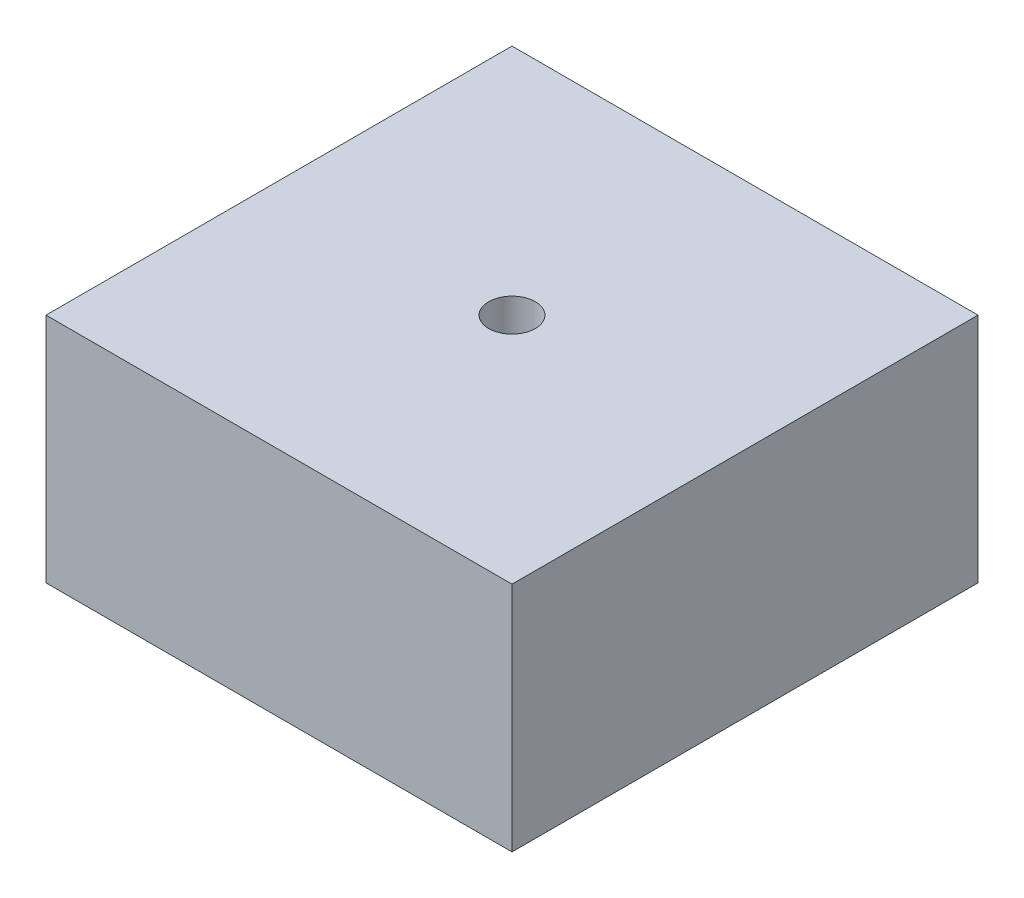
ISO-10303-21;
HEADER;
FILE_DESCRIPTION(('STEP AP214'),'2;1');
FILE_NAME('part.step','',(''),(''),'','','');
FILE_SCHEMA(('AUTOMOTIVE_DESIGN { 1 0 10303 214 1 1 1 1 }'));
ENDSEC;
DATA;
#1=APPLICATION_CONTEXT('core data for automotive mechanical design processes');
#2=APPLICATION_PROTOCOL_DEFINITION('international standard','automotive_design',2000,#1);
#3=PRODUCT_CONTEXT('',#1,'mechanical');
#4=PRODUCT('Part','Part','',(#3));
#5=PRODUCT_RELATED_PRODUCT_CATEGORY('part','',(#4));
#6=PRODUCT_DEFINITION_FORMATION('','',#4);
#7=PRODUCT_DEFINITION_CONTEXT('part definition',#1,'design');
#8=PRODUCT_DEFINITION('design','',#6,#7);
#9=PRODUCT_DEFINITION_SHAPE('','',#8);
#10=(LENGTH_UNIT() NAMED_UNIT(*) SI_UNIT(.MILLI.,.METRE.));
#11=(NAMED_UNIT(*) PLANE_ANGLE_UNIT() SI_UNIT($,.RADIAN.));
#12=(NAMED_UNIT(*) SI_UNIT($,.STERADIAN.) SOLID_ANGLE_UNIT());
#13=UNCERTAINTY_MEASURE_WITH_UNIT(LENGTH_MEASURE(1.E-05),#10,'distance_accuracy_value','');
#14=(GEOMETRIC_REPRESENTATION_CONTEXT(3) GLOBAL_UNCERTAINTY_ASSIGNED_CONTEXT((#13)) GLOBAL_UNIT_ASSIGNED_CONTEXT((#10,
#11,#12)) REPRESENTATION_CONTEXT('',''));
#15=CARTESIAN_POINT('',(0.,0.,0.));
#16=DIRECTION('',(0.,0.,1.));
#17=DIRECTION('',(1.,0.,0.));
#18=AXIS2_PLACEMENT_3D('',#15,#16,#17);
#19=CARTESIAN_POINT('',(50.,37.2625,50.));
#20=DIRECTION('',(-1.,0.,0.));
#21=DIRECTION('',(0.,0.,1.));
#22=AXIS2_PLACEMENT_3D('',#19,#20,#21);
#23=PLANE('',#22);
#24=DIRECTION('',(0.,0.,-1.));
#25=VECTOR('',#24,1.);
#26=CARTESIAN_POINT('',(50.,-12.5,50.));
#27=LINE('',#26,#25);
#28=CARTESIAN_POINT('',(50.,-12.5,50.));
#29=VERTEX_POINT('',#28);
#30=CARTESIAN_POINT('',(50.,-12.5,-50.));
#31=VERTEX_POINT('',#30);
#32=EDGE_CURVE('E94',#29,#31,#27,.T.);
#33=ORIENTED_EDGE('',*,*,#32,.T.);
#34=DIRECTION('',(0.,-1.,0.));
#35=VECTOR('',#34,1.);
#36=CARTESIAN_POINT('',(50.,37.2625,-50.));
#37=LINE('',#36,#35);
#38=CARTESIAN_POINT('',(50.,37.2625,-50.));
#39=VERTEX_POINT('',#38);
#40=EDGE_CURVE('E11',#39,#31,#37,.T.);
#41=ORIENTED_EDGE('',*,*,#40,.F.);
#42=DIRECTION('',(0.,0.,-1.));
#43=VECTOR('',#42,1.);
#44=CARTESIAN_POINT('',(50.,37.2625,50.));
#45=LINE('',#44,#43);
#46=CARTESIAN_POINT('',(50.,37.2625,50.));
#47=VERTEX_POINT('',#46);
#48=EDGE_CURVE('E82',#47,#39,#45,.T.);
#49=ORIENTED_EDGE('',*,*,#48,.F.);
#50=DIRECTION('',(0.,-1.,0.));
#51=VECTOR('',#50,1.);
#52=CARTESIAN_POINT('',(50.,37.2625,50.));
#53=LINE('',#52,#51);
#54=EDGE_CURVE('E90',#47,#29,#53,.T.);
#55=ORIENTED_EDGE('',*,*,#54,.T.);
#56=EDGE_LOOP('',(#33,#41,#49,#55));
#57=FACE_BOUND('',#56,.T.);
#58=ADVANCED_FACE('F31',(#57),#23,.F.);
#59=CARTESIAN_POINT('',(-50.,37.2625,-50.));
#60=DIRECTION('',(0.,0.,1.));
#61=DIRECTION('',(1.,0.,0.));
#62=AXIS2_PLACEMENT_3D('',#59,#60,#61);
#63=PLANE('',#62);
#64=DIRECTION('',(-1.,0.,0.));
#65=VECTOR('',#64,1.);
#66=CARTESIAN_POINT('',(-50.,-12.5,-50.));
#67=LINE('',#66,#65);
#68=CARTESIAN_POINT('',(-50.,-12.5,-50.));
#69=VERTEX_POINT('',#68);
#70=EDGE_CURVE('E86',#31,#69,#67,.T.);
#71=ORIENTED_EDGE('',*,*,#70,.T.);
#72=DIRECTION('',(0.,-1.,0.));
#73=VECTOR('',#72,1.);
#74=CARTESIAN_POINT('',(-50.,37.2625,-50.));
#75=LINE('',#74,#73);
#76=CARTESIAN_POINT('',(-50.,37.2625,-50.));
#77=VERTEX_POINT('',#76);
#78=EDGE_CURVE('E39',#77,#69,#75,.T.);
#79=ORIENTED_EDGE('',*,*,#78,.F.);
#80=DIRECTION('',(-1.,0.,0.));
#81=VECTOR('',#80,1.);
#82=CARTESIAN_POINT('',(-50.,37.2625,-50.));
#83=LINE('',#82,#81);
#84=EDGE_CURVE('E77',#39,#77,#83,.T.);
#85=ORIENTED_EDGE('',*,*,#84,.F.);
#86=ORIENTED_EDGE('',*,*,#40,.T.);
#87=EDGE_LOOP('',(#71,#79,#85,#86));
#88=FACE_BOUND('',#87,.T.);
#89=ADVANCED_FACE('F85',(#88),#63,.F.);
#90=CARTESIAN_POINT('',(-50.,37.2625,50.));
#91=DIRECTION('',(1.,0.,0.));
#92=DIRECTION('',(0.,0.,-1.));
#93=AXIS2_PLACEMENT_3D('',#90,#91,#92);
#94=PLANE('',#93);
#95=DIRECTION('',(0.,0.,1.));
#96=VECTOR('',#95,1.);
#97=CARTESIAN_POINT('',(-50.,-12.5,50.));
#98=LINE('',#97,#96);
#99=CARTESIAN_POINT('',(-50.,-12.5,50.));
#100=VERTEX_POINT('',#99);
#101=EDGE_CURVE('E64',#69,#100,#98,.T.);
#102=ORIENTED_EDGE('',*,*,#101,.T.);
#103=DIRECTION('',(0.,-1.,0.));
#104=VECTOR('',#103,1.);
#105=CARTESIAN_POINT('',(-50.,37.2625,50.));
#106=LINE('',#105,#104);
#107=CARTESIAN_POINT('',(-50.,37.2625,50.));
#108=VERTEX_POINT('',#107);
#109=EDGE_CURVE('E87',#108,#100,#106,.T.);
#110=ORIENTED_EDGE('',*,*,#109,.F.);
#111=DIRECTION('',(0.,0.,1.));
#112=VECTOR('',#111,1.);
#113=CARTESIAN_POINT('',(-50.,37.2625,50.));
#114=LINE('',#113,#112);
#115=EDGE_CURVE('E80',#77,#108,#114,.T.);
#116=ORIENTED_EDGE('',*,*,#115,.F.);
#117=ORIENTED_EDGE('',*,*,#78,.T.);
#118=EDGE_LOOP('',(#102,#110,#116,#117));
#119=FACE_BOUND('',#118,.T.);
#120=ADVANCED_FACE('F88',(#119),#94,.F.);
#121=CARTESIAN_POINT('',(-50.,37.2625,50.));
#122=DIRECTION('',(0.,0.,-1.));
#123=DIRECTION('',(-1.,0.,0.));
#124=AXIS2_PLACEMENT_3D('',#121,#122,#123);
#125=PLANE('',#124);
#126=DIRECTION('',(1.,0.,0.));
#127=VECTOR('',#126,1.);
#128=CARTESIAN_POINT('',(-50.,-12.5,50.));
#129=LINE('',#128,#127);
#130=EDGE_CURVE('E70',#100,#29,#129,.T.);
#131=ORIENTED_EDGE('',*,*,#130,.T.);
#132=ORIENTED_EDGE('',*,*,#54,.F.);
#133=DIRECTION('',(1.,0.,0.));
#134=VECTOR('',#133,1.);
#135=CARTESIAN_POINT('',(-50.,37.2625,50.));
#136=LINE('',#135,#134);
#137=EDGE_CURVE('E47',#108,#47,#136,.T.);
#138=ORIENTED_EDGE('',*,*,#137,.F.);
#139=ORIENTED_EDGE('',*,*,#109,.T.);
#140=EDGE_LOOP('',(#131,#132,#138,#139));
#141=FACE_BOUND('',#140,.T.);
#142=ADVANCED_FACE('F102',(#141),#125,.F.);
#143=CARTESIAN_POINT('',(50.,37.2625,-50.));
#144=DIRECTION('',(0.,-1.,0.));
#145=DIRECTION('',(0.,0.,-1.));
#146=AXIS2_PLACEMENT_3D('',#143,#144,#145);
#147=PLANE('',#146);
#148=CARTESIAN_POINT('',(0.,37.2625,0.));
#149=DIRECTION('',(0.,1.,0.));
#150=DIRECTION('',(0.,0.,1.));
#151=AXIS2_PLACEMENT_3D('',#148,#149,#150);
#152=CIRCLE('',#151,5.);
#153=CARTESIAN_POINT('',(0.,37.2625,5.));
#154=VERTEX_POINT('',#153);
#155=EDGE_CURVE('E108',#154,#154,#152,.T.);
#156=ORIENTED_EDGE('',*,*,#155,.F.);
#157=EDGE_LOOP('',(#156));
#158=FACE_BOUND('',#157,.T.);
#159=ORIENTED_EDGE('',*,*,#48,.T.);
#160=ORIENTED_EDGE('',*,*,#84,.T.);
#161=ORIENTED_EDGE('',*,*,#115,.T.);
#162=ORIENTED_EDGE('',*,*,#137,.T.);
#163=EDGE_LOOP('',(#159,#160,#161,#162));
#164=FACE_BOUND('',#163,.T.);
#165=ADVANCED_FACE('F78',(#158,#164),#147,.F.);
#166=CARTESIAN_POINT('',(50.,-12.5,-50.));
#167=DIRECTION('',(0.,-1.,0.));
#168=DIRECTION('',(0.,0.,-1.));
#169=AXIS2_PLACEMENT_3D('',#166,#167,#168);
#170=PLANE('',#169);
#171=CARTESIAN_POINT('',(0.,-12.5,0.));
#172=DIRECTION('',(0.,1.,0.));
#173=DIRECTION('',(0.,0.,1.));
#174=AXIS2_PLACEMENT_3D('',#171,#172,#173);
#175=CIRCLE('',#174,5.);
#176=CARTESIAN_POINT('',(0.,-12.5,5.));
#177=VERTEX_POINT('',#176);
#178=EDGE_CURVE('E97',#177,#177,#175,.T.);
#179=ORIENTED_EDGE('',*,*,#178,.T.);
#180=EDGE_LOOP('',(#179));
#181=FACE_BOUND('',#180,.T.);
#182=ORIENTED_EDGE('',*,*,#32,.F.);
#183=ORIENTED_EDGE('',*,*,#130,.F.);
#184=ORIENTED_EDGE('',*,*,#101,.F.);
#185=ORIENTED_EDGE('',*,*,#70,.F.);
#186=EDGE_LOOP('',(#182,#183,#184,#185));
#187=FACE_BOUND('',#186,.T.);
#188=ADVANCED_FACE('F105',(#181,#187),#170,.T.);
#189=CARTESIAN_POINT('',(0.,-12.5,0.));
#190=DIRECTION('',(0.,1.,0.));
#191=DIRECTION('',(0.,0.,1.));
#192=AXIS2_PLACEMENT_3D('',#189,#190,#191);
#193=CYLINDRICAL_SURFACE('',#192,5.);
#194=ORIENTED_EDGE('',*,*,#178,.F.);
#195=EDGE_LOOP('',(#194));
#196=FACE_BOUND('',#195,.T.);
#197=ORIENTED_EDGE('',*,*,#155,.T.);
#198=EDGE_LOOP('',(#197));
#199=FACE_BOUND('',#198,.T.);
#200=ADVANCED_FACE('F115',(#196,#199),#193,.F.);
#201=CLOSED_SHELL('',(#58,#89,#120,#142,#165,#188,#200));
#202=MANIFOLD_SOLID_BREP('B2',#201);
#203=ADVANCED_BREP_SHAPE_REPRESENTATION('',(#18,#202),#14);
#204=SHAPE_DEFINITION_REPRESENTATION(#9,#203);
ENDSEC;
END-ISO-10303-21;
